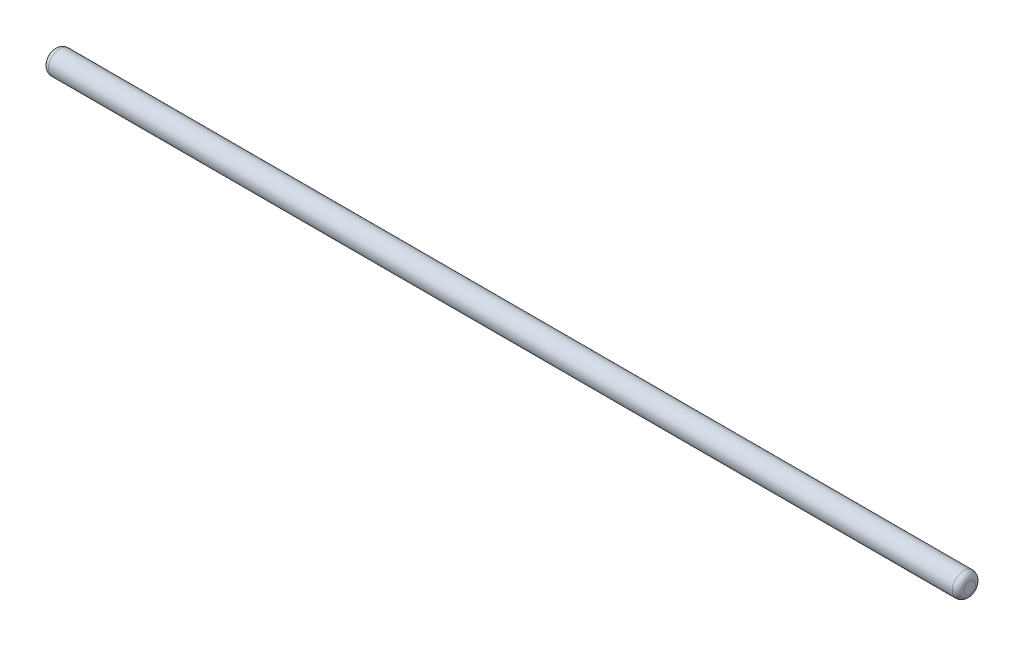
ISO-10303-21;
HEADER;
FILE_DESCRIPTION(('STEP AP214'),'2;1');
FILE_NAME('part.step','',(''),(''),'','','');
FILE_SCHEMA(('AUTOMOTIVE_DESIGN { 1 0 10303 214 1 1 1 1 }'));
ENDSEC;
DATA;
#1=APPLICATION_CONTEXT('core data for automotive mechanical design processes');
#2=APPLICATION_PROTOCOL_DEFINITION('international standard','automotive_design',2000,#1);
#3=PRODUCT_CONTEXT('',#1,'mechanical');
#4=PRODUCT('Part','Part','',(#3));
#5=PRODUCT_RELATED_PRODUCT_CATEGORY('part','',(#4));
#6=PRODUCT_DEFINITION_FORMATION('','',#4);
#7=PRODUCT_DEFINITION_CONTEXT('part definition',#1,'design');
#8=PRODUCT_DEFINITION('design','',#6,#7);
#9=PRODUCT_DEFINITION_SHAPE('','',#8);
#10=(LENGTH_UNIT() NAMED_UNIT(*) SI_UNIT(.MILLI.,.METRE.));
#11=(NAMED_UNIT(*) PLANE_ANGLE_UNIT() SI_UNIT($,.RADIAN.));
#12=(NAMED_UNIT(*) SI_UNIT($,.STERADIAN.) SOLID_ANGLE_UNIT());
#13=UNCERTAINTY_MEASURE_WITH_UNIT(LENGTH_MEASURE(1.E-05),#10,'distance_accuracy_value','');
#14=(GEOMETRIC_REPRESENTATION_CONTEXT(3) GLOBAL_UNCERTAINTY_ASSIGNED_CONTEXT((#13)) GLOBAL_UNIT_ASSIGNED_CONTEXT((#10,
#11,#12)) REPRESENTATION_CONTEXT('',''));
#15=CARTESIAN_POINT('',(0.,0.,0.));
#16=DIRECTION('',(0.,0.,1.));
#17=DIRECTION('',(1.,0.,0.));
#18=AXIS2_PLACEMENT_3D('',#15,#16,#17);
#19=CARTESIAN_POINT('',(157.,0.,0.));
#20=DIRECTION('',(-1.,0.,0.));
#21=DIRECTION('',(0.,0.,1.));
#22=AXIS2_PLACEMENT_3D('',#19,#20,#21);
#23=CYLINDRICAL_SURFACE('',#22,2.);
#24=CARTESIAN_POINT('',(1.,0.,0.));
#25=DIRECTION('',(1.,0.,0.));
#26=DIRECTION('',(0.,0.,-1.));
#27=AXIS2_PLACEMENT_3D('',#24,#25,#26);
#28=CIRCLE('',#27,2.);
#29=CARTESIAN_POINT('',(1.,0.,-2.));
#30=VERTEX_POINT('',#29);
#31=EDGE_CURVE('E42',#30,#30,#28,.T.);
#32=ORIENTED_EDGE('',*,*,#31,.T.);
#33=EDGE_LOOP('',(#32));
#34=FACE_BOUND('',#33,.T.);
#35=CARTESIAN_POINT('',(156.,0.,0.));
#36=DIRECTION('',(1.,0.,0.));
#37=DIRECTION('',(0.,0.,-1.));
#38=AXIS2_PLACEMENT_3D('',#35,#36,#37);
#39=CIRCLE('',#38,2.);
#40=CARTESIAN_POINT('',(156.,0.,-2.));
#41=VERTEX_POINT('',#40);
#42=EDGE_CURVE('E46',#41,#41,#39,.F.);
#43=ORIENTED_EDGE('',*,*,#42,.T.);
#44=EDGE_LOOP('',(#43));
#45=FACE_BOUND('',#44,.T.);
#46=ADVANCED_FACE('F31',(#34,#45),#23,.T.);
#47=CARTESIAN_POINT('',(157.,0.,0.));
#48=DIRECTION('',(1.,0.,0.));
#49=DIRECTION('',(0.,0.,-1.));
#50=AXIS2_PLACEMENT_3D('',#47,#48,#49);
#51=PLANE('',#50);
#52=CARTESIAN_POINT('',(157.,0.,0.));
#53=DIRECTION('',(1.,0.,0.));
#54=DIRECTION('',(0.,0.,-1.));
#55=AXIS2_PLACEMENT_3D('',#52,#53,#54);
#56=CIRCLE('',#55,1.);
#57=CARTESIAN_POINT('',(157.,0.,-1.));
#58=VERTEX_POINT('',#57);
#59=EDGE_CURVE('E10',#58,#58,#56,.T.);
#60=ORIENTED_EDGE('',*,*,#59,.T.);
#61=EDGE_LOOP('',(#60));
#62=FACE_BOUND('',#61,.T.);
#63=ADVANCED_FACE('F62',(#62),#51,.T.);
#64=CARTESIAN_POINT('',(0.,0.,0.));
#65=DIRECTION('',(1.,0.,0.));
#66=DIRECTION('',(0.,0.,-1.));
#67=AXIS2_PLACEMENT_3D('',#64,#65,#66);
#68=PLANE('',#67);
#69=CARTESIAN_POINT('',(0.,0.,0.));
#70=DIRECTION('',(1.,0.,0.));
#71=DIRECTION('',(0.,0.,-1.));
#72=AXIS2_PLACEMENT_3D('',#69,#70,#71);
#73=CIRCLE('',#72,1.);
#74=CARTESIAN_POINT('',(0.,0.,-1.));
#75=VERTEX_POINT('',#74);
#76=EDGE_CURVE('E38',#75,#75,#73,.F.);
#77=ORIENTED_EDGE('',*,*,#76,.T.);
#78=EDGE_LOOP('',(#77));
#79=FACE_BOUND('',#78,.T.);
#80=ADVANCED_FACE('F59',(#79),#68,.F.);
#81=CARTESIAN_POINT('',(1.,0.,0.));
#82=DIRECTION('',(1.,0.,0.));
#83=DIRECTION('',(0.,0.,-1.));
#84=AXIS2_PLACEMENT_3D('',#81,#82,#83);
#85=DEGENERATE_TOROIDAL_SURFACE('',#84,1.,1.,.T.);
#86=ORIENTED_EDGE('',*,*,#76,.F.);
#87=EDGE_LOOP('',(#86));
#88=FACE_BOUND('',#87,.T.);
#89=ORIENTED_EDGE('',*,*,#31,.F.);
#90=EDGE_LOOP('',(#89));
#91=FACE_BOUND('',#90,.T.);
#92=ADVANCED_FACE('F55',(#88,#91),#85,.T.);
#93=CARTESIAN_POINT('',(156.,0.,0.));
#94=DIRECTION('',(1.,0.,0.));
#95=DIRECTION('',(0.,0.,-1.));
#96=AXIS2_PLACEMENT_3D('',#93,#94,#95);
#97=DEGENERATE_TOROIDAL_SURFACE('',#96,1.,1.,.T.);
#98=ORIENTED_EDGE('',*,*,#42,.F.);
#99=EDGE_LOOP('',(#98));
#100=FACE_BOUND('',#99,.T.);
#101=ORIENTED_EDGE('',*,*,#59,.F.);
#102=EDGE_LOOP('',(#101));
#103=FACE_BOUND('',#102,.T.);
#104=ADVANCED_FACE('F33',(#100,#103),#97,.T.);
#105=CLOSED_SHELL('',(#46,#63,#80,#92,#104));
#106=MANIFOLD_SOLID_BREP('B2',#105);
#107=ADVANCED_BREP_SHAPE_REPRESENTATION('',(#18,#106),#14);
#108=SHAPE_DEFINITION_REPRESENTATION(#9,#107);
ENDSEC;
END-ISO-10303-21;
